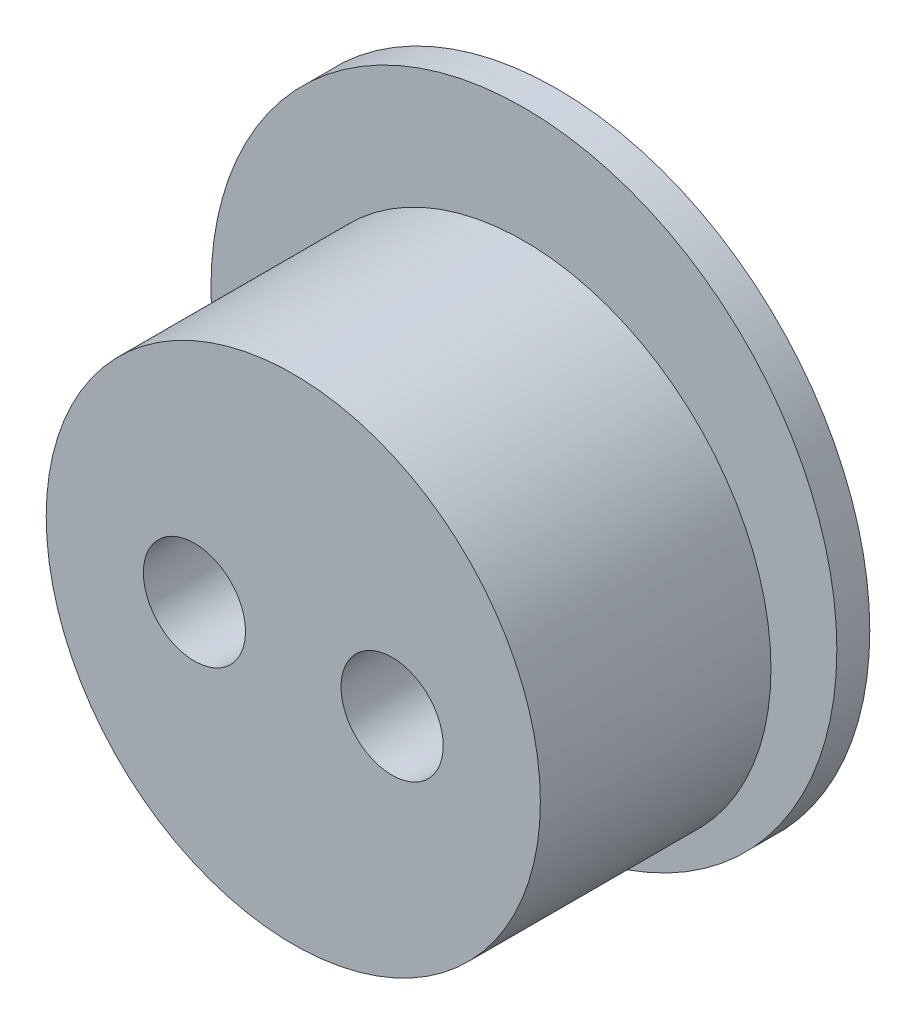
ISO-10303-21;
HEADER;
FILE_DESCRIPTION(('STEP AP214'),'2;1');
FILE_NAME('part.step','',(''),(''),'','','');
FILE_SCHEMA(('AUTOMOTIVE_DESIGN { 1 0 10303 214 1 1 1 1 }'));
ENDSEC;
DATA;
#1=APPLICATION_CONTEXT('core data for automotive mechanical design processes');
#2=APPLICATION_PROTOCOL_DEFINITION('international standard','automotive_design',2000,#1);
#3=PRODUCT_CONTEXT('',#1,'mechanical');
#4=PRODUCT('Part','Part','',(#3));
#5=PRODUCT_RELATED_PRODUCT_CATEGORY('part','',(#4));
#6=PRODUCT_DEFINITION_FORMATION('','',#4);
#7=PRODUCT_DEFINITION_CONTEXT('part definition',#1,'design');
#8=PRODUCT_DEFINITION('design','',#6,#7);
#9=PRODUCT_DEFINITION_SHAPE('','',#8);
#10=(LENGTH_UNIT() NAMED_UNIT(*) SI_UNIT(.MILLI.,.METRE.));
#11=(NAMED_UNIT(*) PLANE_ANGLE_UNIT() SI_UNIT($,.RADIAN.));
#12=(NAMED_UNIT(*) SI_UNIT($,.STERADIAN.) SOLID_ANGLE_UNIT());
#13=UNCERTAINTY_MEASURE_WITH_UNIT(LENGTH_MEASURE(1.E-05),#10,'distance_accuracy_value','');
#14=(GEOMETRIC_REPRESENTATION_CONTEXT(3) GLOBAL_UNCERTAINTY_ASSIGNED_CONTEXT((#13)) GLOBAL_UNIT_ASSIGNED_CONTEXT((#10,
#11,#12)) REPRESENTATION_CONTEXT('',''));
#15=CARTESIAN_POINT('',(0.,0.,0.));
#16=DIRECTION('',(0.,0.,1.));
#17=DIRECTION('',(1.,0.,0.));
#18=AXIS2_PLACEMENT_3D('',#15,#16,#17);
#19=CARTESIAN_POINT('',(0.,0.,1.));
#20=DIRECTION('',(0.,0.,-1.));
#21=DIRECTION('',(-1.,0.,0.));
#22=AXIS2_PLACEMENT_3D('',#19,#20,#21);
#23=CYLINDRICAL_SURFACE('',#22,9.5);
#24=CARTESIAN_POINT('',(0.,0.,1.));
#25=DIRECTION('',(0.,0.,1.));
#26=DIRECTION('',(1.,0.,0.));
#27=AXIS2_PLACEMENT_3D('',#24,#25,#26);
#28=CIRCLE('',#27,9.5);
#29=CARTESIAN_POINT('',(9.5,0.,1.));
#30=VERTEX_POINT('',#29);
#31=EDGE_CURVE('E45',#30,#30,#28,.T.);
#32=ORIENTED_EDGE('',*,*,#31,.F.);
#33=EDGE_LOOP('',(#32));
#34=FACE_BOUND('',#33,.T.);
#35=CARTESIAN_POINT('',(0.,0.,0.));
#36=DIRECTION('',(0.,0.,1.));
#37=DIRECTION('',(1.,0.,0.));
#38=AXIS2_PLACEMENT_3D('',#35,#36,#37);
#39=CIRCLE('',#38,9.5);
#40=CARTESIAN_POINT('',(9.5,0.,0.));
#41=VERTEX_POINT('',#40);
#42=EDGE_CURVE('E40',#41,#41,#39,.T.);
#43=ORIENTED_EDGE('',*,*,#42,.T.);
#44=EDGE_LOOP('',(#43));
#45=FACE_BOUND('',#44,.T.);
#46=ADVANCED_FACE('F37',(#34,#45),#23,.T.);
#47=CARTESIAN_POINT('',(0.,0.,1.));
#48=DIRECTION('',(0.,0.,1.));
#49=DIRECTION('',(1.,0.,0.));
#50=AXIS2_PLACEMENT_3D('',#47,#48,#49);
#51=PLANE('',#50);
#52=CARTESIAN_POINT('',(0.,-1.5,1.));
#53=DIRECTION('',(0.,0.,1.));
#54=DIRECTION('',(1.,0.,0.));
#55=AXIS2_PLACEMENT_3D('',#52,#53,#54);
#56=CIRCLE('',#55,7.5);
#57=CARTESIAN_POINT('',(7.5,-1.5,1.));
#58=VERTEX_POINT('',#57);
#59=EDGE_CURVE('E10',#58,#58,#56,.T.);
#60=ORIENTED_EDGE('',*,*,#59,.F.);
#61=EDGE_LOOP('',(#60));
#62=FACE_BOUND('',#61,.T.);
#63=ORIENTED_EDGE('',*,*,#31,.T.);
#64=EDGE_LOOP('',(#63));
#65=FACE_BOUND('',#64,.T.);
#66=ADVANCED_FACE('F97',(#62,#65),#51,.T.);
#67=CARTESIAN_POINT('',(0.,0.,0.));
#68=DIRECTION('',(0.,0.,1.));
#69=DIRECTION('',(1.,0.,0.));
#70=AXIS2_PLACEMENT_3D('',#67,#68,#69);
#71=PLANE('',#70);
#72=CARTESIAN_POINT('',(3.,-1.5,0.));
#73=DIRECTION('',(0.,0.,1.));
#74=DIRECTION('',(1.,0.,0.));
#75=AXIS2_PLACEMENT_3D('',#72,#73,#74);
#76=CIRCLE('',#75,1.55);
#77=CARTESIAN_POINT('',(4.55,-1.5,0.));
#78=VERTEX_POINT('',#77);
#79=EDGE_CURVE('E56',#78,#78,#76,.T.);
#80=ORIENTED_EDGE('',*,*,#79,.T.);
#81=EDGE_LOOP('',(#80));
#82=FACE_BOUND('',#81,.T.);
#83=CARTESIAN_POINT('',(-3.,-1.5,0.));
#84=DIRECTION('',(0.,0.,1.));
#85=DIRECTION('',(-1.,0.,0.));
#86=AXIS2_PLACEMENT_3D('',#83,#84,#85);
#87=CIRCLE('',#86,1.55);
#88=CARTESIAN_POINT('',(-4.55,-1.5,0.));
#89=VERTEX_POINT('',#88);
#90=EDGE_CURVE('E61',#89,#89,#87,.T.);
#91=ORIENTED_EDGE('',*,*,#90,.T.);
#92=EDGE_LOOP('',(#91));
#93=FACE_BOUND('',#92,.T.);
#94=ORIENTED_EDGE('',*,*,#42,.F.);
#95=EDGE_LOOP('',(#94));
#96=FACE_BOUND('',#95,.T.);
#97=ADVANCED_FACE('F73',(#82,#93,#96),#71,.F.);
#98=CARTESIAN_POINT('',(0.,-1.5,8.));
#99=DIRECTION('',(0.,0.,-1.));
#100=DIRECTION('',(-1.,0.,0.));
#101=AXIS2_PLACEMENT_3D('',#98,#99,#100);
#102=CYLINDRICAL_SURFACE('',#101,7.5);
#103=CARTESIAN_POINT('',(0.,-1.5,8.));
#104=DIRECTION('',(0.,0.,1.));
#105=DIRECTION('',(1.,0.,0.));
#106=AXIS2_PLACEMENT_3D('',#103,#104,#105);
#107=CIRCLE('',#106,7.5);
#108=CARTESIAN_POINT('',(7.5,-1.5,8.));
#109=VERTEX_POINT('',#108);
#110=EDGE_CURVE('E52',#109,#109,#107,.T.);
#111=ORIENTED_EDGE('',*,*,#110,.F.);
#112=EDGE_LOOP('',(#111));
#113=FACE_BOUND('',#112,.T.);
#114=ORIENTED_EDGE('',*,*,#59,.T.);
#115=EDGE_LOOP('',(#114));
#116=FACE_BOUND('',#115,.T.);
#117=ADVANCED_FACE('F86',(#113,#116),#102,.T.);
#118=CARTESIAN_POINT('',(0.,-1.5,8.));
#119=DIRECTION('',(0.,0.,1.));
#120=DIRECTION('',(1.,0.,0.));
#121=AXIS2_PLACEMENT_3D('',#118,#119,#120);
#122=PLANE('',#121);
#123=CARTESIAN_POINT('',(3.,-1.5,8.));
#124=DIRECTION('',(0.,0.,1.));
#125=DIRECTION('',(1.,0.,0.));
#126=AXIS2_PLACEMENT_3D('',#123,#124,#125);
#127=CIRCLE('',#126,1.55);
#128=CARTESIAN_POINT('',(4.55,-1.5,8.));
#129=VERTEX_POINT('',#128);
#130=EDGE_CURVE('E65',#129,#129,#127,.T.);
#131=ORIENTED_EDGE('',*,*,#130,.F.);
#132=EDGE_LOOP('',(#131));
#133=FACE_BOUND('',#132,.T.);
#134=CARTESIAN_POINT('',(-3.,-1.5,8.));
#135=DIRECTION('',(0.,0.,1.));
#136=DIRECTION('',(-1.,0.,0.));
#137=AXIS2_PLACEMENT_3D('',#134,#135,#136);
#138=CIRCLE('',#137,1.55);
#139=CARTESIAN_POINT('',(-4.55,-1.5,8.));
#140=VERTEX_POINT('',#139);
#141=EDGE_CURVE('E57',#140,#140,#138,.T.);
#142=ORIENTED_EDGE('',*,*,#141,.F.);
#143=EDGE_LOOP('',(#142));
#144=FACE_BOUND('',#143,.T.);
#145=ORIENTED_EDGE('',*,*,#110,.T.);
#146=EDGE_LOOP('',(#145));
#147=FACE_BOUND('',#146,.T.);
#148=ADVANCED_FACE('F83',(#133,#144,#147),#122,.T.);
#149=CARTESIAN_POINT('',(-3.,-1.5,0.));
#150=DIRECTION('',(0.,0.,1.));
#151=DIRECTION('',(1.,0.,0.));
#152=AXIS2_PLACEMENT_3D('',#149,#150,#151);
#153=CYLINDRICAL_SURFACE('',#152,1.55);
#154=ORIENTED_EDGE('',*,*,#90,.F.);
#155=EDGE_LOOP('',(#154));
#156=FACE_BOUND('',#155,.T.);
#157=ORIENTED_EDGE('',*,*,#141,.T.);
#158=EDGE_LOOP('',(#157));
#159=FACE_BOUND('',#158,.T.);
#160=ADVANCED_FACE('F79',(#156,#159),#153,.F.);
#161=CARTESIAN_POINT('',(3.,-1.5,0.));
#162=DIRECTION('',(0.,0.,1.));
#163=DIRECTION('',(1.,0.,0.));
#164=AXIS2_PLACEMENT_3D('',#161,#162,#163);
#165=CYLINDRICAL_SURFACE('',#164,1.55);
#166=ORIENTED_EDGE('',*,*,#79,.F.);
#167=EDGE_LOOP('',(#166));
#168=FACE_BOUND('',#167,.T.);
#169=ORIENTED_EDGE('',*,*,#130,.T.);
#170=EDGE_LOOP('',(#169));
#171=FACE_BOUND('',#170,.T.);
#172=ADVANCED_FACE('F76',(#168,#171),#165,.F.);
#173=CLOSED_SHELL('',(#46,#66,#97,#117,#148,#160,#172));
#174=MANIFOLD_SOLID_BREP('B2',#173);
#175=ADVANCED_BREP_SHAPE_REPRESENTATION('',(#18,#174),#14);
#176=SHAPE_DEFINITION_REPRESENTATION(#9,#175);
ENDSEC;
END-ISO-10303-21;
